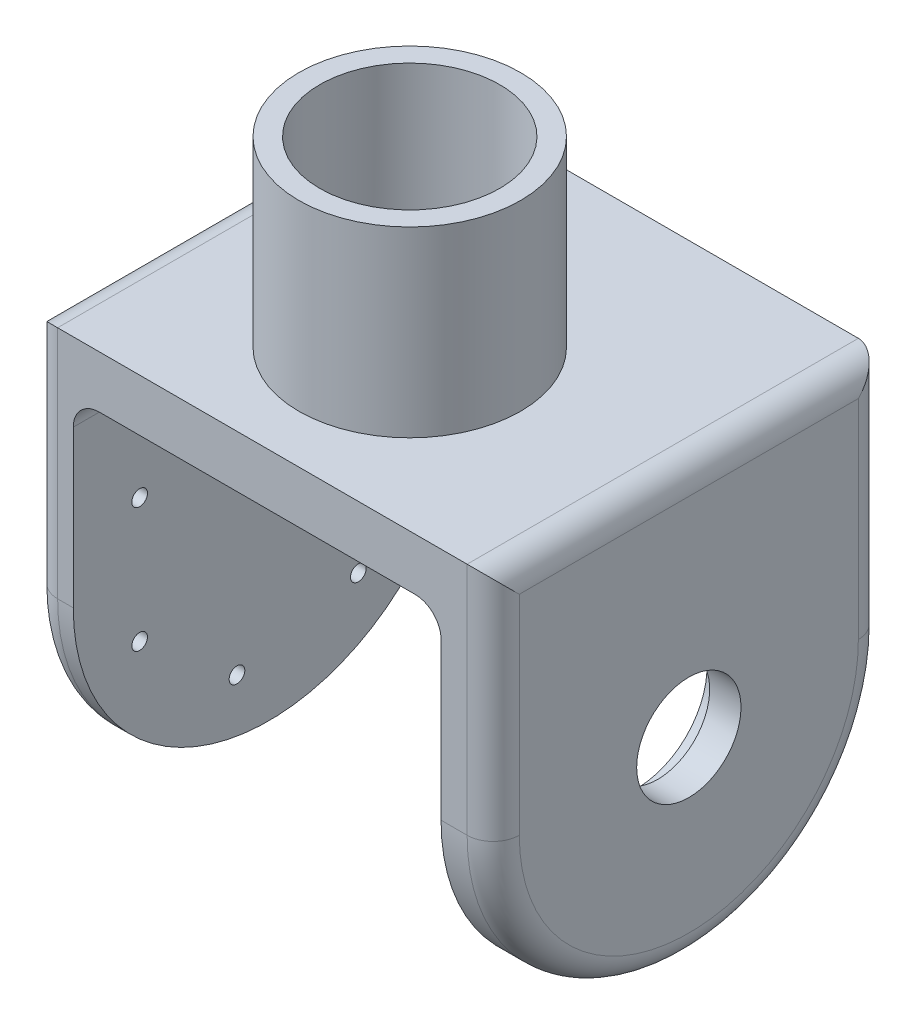
ISO-10303-21;
HEADER;
FILE_DESCRIPTION(('STEP AP214'),'2;1');
FILE_NAME('part.step','',(''),(''),'','','');
FILE_SCHEMA(('AUTOMOTIVE_DESIGN { 1 0 10303 214 1 1 1 1 }'));
ENDSEC;
DATA;
#1=APPLICATION_CONTEXT('core data for automotive mechanical design processes');
#2=APPLICATION_PROTOCOL_DEFINITION('international standard','automotive_design',2000,#1);
#3=PRODUCT_CONTEXT('',#1,'mechanical');
#4=PRODUCT('Part','Part','',(#3));
#5=PRODUCT_RELATED_PRODUCT_CATEGORY('part','',(#4));
#6=PRODUCT_DEFINITION_FORMATION('','',#4);
#7=PRODUCT_DEFINITION_CONTEXT('part definition',#1,'design');
#8=PRODUCT_DEFINITION('design','',#6,#7);
#9=PRODUCT_DEFINITION_SHAPE('','',#8);
#10=(LENGTH_UNIT() NAMED_UNIT(*) SI_UNIT(.MILLI.,.METRE.));
#11=(NAMED_UNIT(*) PLANE_ANGLE_UNIT() SI_UNIT($,.RADIAN.));
#12=(NAMED_UNIT(*) SI_UNIT($,.STERADIAN.) SOLID_ANGLE_UNIT());
#13=UNCERTAINTY_MEASURE_WITH_UNIT(LENGTH_MEASURE(1.E-05),#10,'distance_accuracy_value','');
#14=(GEOMETRIC_REPRESENTATION_CONTEXT(3) GLOBAL_UNCERTAINTY_ASSIGNED_CONTEXT((#13)) GLOBAL_UNIT_ASSIGNED_CONTEXT((#10,
#11,#12)) REPRESENTATION_CONTEXT('',''));
#15=CARTESIAN_POINT('',(0.,0.,0.));
#16=DIRECTION('',(0.,0.,1.));
#17=DIRECTION('',(1.,0.,0.));
#18=AXIS2_PLACEMENT_3D('',#15,#16,#17);
#19=CARTESIAN_POINT('',(8.,45.,37.5));
#20=DIRECTION('',(0.,-1.,0.));
#21=DIRECTION('',(0.,0.,-1.));
#22=AXIS2_PLACEMENT_3D('',#19,#20,#21);
#23=PLANE('',#22);
#24=CARTESIAN_POINT('',(42.,45.,7.));
#25=DIRECTION('',(0.,-1.,0.));
#26=DIRECTION('',(0.,0.,-1.));
#27=AXIS2_PLACEMENT_3D('',#24,#25,#26);
#28=CIRCLE('',#27,21.25);
#29=CARTESIAN_POINT('',(42.,45.,-14.25));
#30=VERTEX_POINT('',#29);
#31=EDGE_CURVE('E88',#30,#30,#28,.F.);
#32=ORIENTED_EDGE('',*,*,#31,.F.);
#33=EDGE_LOOP('',(#32));
#34=FACE_BOUND('',#33,.T.);
#35=CARTESIAN_POINT('',(42.,45.,7.));
#36=DIRECTION('',(0.,-1.,0.));
#37=DIRECTION('',(0.,0.,-1.));
#38=AXIS2_PLACEMENT_3D('',#35,#36,#37);
#39=CIRCLE('',#38,17.25);
#40=CARTESIAN_POINT('',(42.,45.,-10.25));
#41=VERTEX_POINT('',#40);
#42=EDGE_CURVE('E79',#41,#41,#39,.F.);
#43=ORIENTED_EDGE('',*,*,#42,.T.);
#44=EDGE_LOOP('',(#43));
#45=FACE_BOUND('',#44,.T.);
#46=ADVANCED_FACE('F75',(#34,#45),#23,.T.);
#47=CARTESIAN_POINT('',(42.,80.,7.));
#48=DIRECTION('',(0.,1.,0.));
#49=DIRECTION('',(0.,0.,1.));
#50=AXIS2_PLACEMENT_3D('',#47,#48,#49);
#51=PLANE('',#50);
#52=CARTESIAN_POINT('',(42.,80.,7.));
#53=DIRECTION('',(0.,1.,0.));
#54=DIRECTION('',(0.,0.,1.));
#55=AXIS2_PLACEMENT_3D('',#52,#53,#54);
#56=CIRCLE('',#55,17.25);
#57=CARTESIAN_POINT('',(42.,80.,24.25));
#58=VERTEX_POINT('',#57);
#59=EDGE_CURVE('E83',#58,#58,#56,.T.);
#60=ORIENTED_EDGE('',*,*,#59,.F.);
#61=EDGE_LOOP('',(#60));
#62=FACE_BOUND('',#61,.T.);
#63=CARTESIAN_POINT('',(42.,80.,7.));
#64=DIRECTION('',(0.,1.,0.));
#65=DIRECTION('',(0.,0.,1.));
#66=AXIS2_PLACEMENT_3D('',#63,#64,#65);
#67=CIRCLE('',#66,21.25);
#68=CARTESIAN_POINT('',(42.,80.,28.25));
#69=VERTEX_POINT('',#68);
#70=EDGE_CURVE('E12',#69,#69,#67,.T.);
#71=ORIENTED_EDGE('',*,*,#70,.T.);
#72=EDGE_LOOP('',(#71));
#73=FACE_BOUND('',#72,.T.);
#74=ADVANCED_FACE('F103',(#62,#73),#51,.T.);
#75=CARTESIAN_POINT('',(42.,-37.502,7.));
#76=DIRECTION('',(0.,1.,0.));
#77=DIRECTION('',(0.,0.,1.));
#78=AXIS2_PLACEMENT_3D('',#75,#76,#77);
#79=CYLINDRICAL_SURFACE('',#78,21.25);
#80=ORIENTED_EDGE('',*,*,#70,.F.);
#81=EDGE_LOOP('',(#80));
#82=FACE_BOUND('',#81,.T.);
#83=ORIENTED_EDGE('',*,*,#31,.T.);
#84=EDGE_LOOP('',(#83));
#85=FACE_BOUND('',#84,.T.);
#86=ADVANCED_FACE('F98',(#82,#85),#79,.T.);
#87=CARTESIAN_POINT('',(42.,-37.502,7.));
#88=DIRECTION('',(0.,1.,0.));
#89=DIRECTION('',(0.,0.,1.));
#90=AXIS2_PLACEMENT_3D('',#87,#88,#89);
#91=CYLINDRICAL_SURFACE('',#90,17.25);
#92=ORIENTED_EDGE('',*,*,#59,.T.);
#93=EDGE_LOOP('',(#92));
#94=FACE_BOUND('',#93,.T.);
#95=ORIENTED_EDGE('',*,*,#42,.F.);
#96=EDGE_LOOP('',(#95));
#97=FACE_BOUND('',#96,.T.);
#98=ADVANCED_FACE('F77',(#94,#97),#91,.F.);
#99=CLOSED_SHELL('',(#46,#74,#86,#98));
#100=MANIFOLD_SOLID_BREP('B2_NOT_SHOWN',#99);
#101=CARTESIAN_POINT('',(88.5,0.,0.));
#102=DIRECTION('',(-1.,0.,0.));
#103=DIRECTION('',(0.,0.,1.));
#104=AXIS2_PLACEMENT_3D('',#101,#102,#103);
#105=CYLINDRICAL_SURFACE('',#104,10.);
#106=CARTESIAN_POINT('',(88.5,0.,0.));
#107=DIRECTION('',(1.,0.,0.));
#108=DIRECTION('',(0.,0.,-1.));
#109=AXIS2_PLACEMENT_3D('',#106,#107,#108);
#110=CIRCLE('',#109,10.);
#111=CARTESIAN_POINT('',(88.5,0.,-10.));
#112=VERTEX_POINT('',#111);
#113=EDGE_CURVE('E265',#112,#112,#110,.T.);
#114=ORIENTED_EDGE('',*,*,#113,.T.);
#115=EDGE_LOOP('',(#114));
#116=FACE_BOUND('',#115,.T.);
#117=CARTESIAN_POINT('',(82.5,0.,0.));
#118=DIRECTION('',(-1.,0.,0.));
#119=DIRECTION('',(0.,0.,1.));
#120=AXIS2_PLACEMENT_3D('',#117,#118,#119);
#121=CIRCLE('',#120,10.);
#122=CARTESIAN_POINT('',(82.5,0.,10.));
#123=VERTEX_POINT('',#122);
#124=EDGE_CURVE('E342',#123,#123,#121,.T.);
#125=ORIENTED_EDGE('',*,*,#124,.T.);
#126=EDGE_LOOP('',(#125));
#127=FACE_BOUND('',#126,.T.);
#128=ADVANCED_FACE('F137',(#116,#127),#105,.F.);
#129=CARTESIAN_POINT('',(78.5,0.,0.));
#130=DIRECTION('',(1.,0.,0.));
#131=DIRECTION('',(0.,0.,-1.));
#132=AXIS2_PLACEMENT_3D('',#129,#130,#131);
#133=PLANE('',#132);
#134=CARTESIAN_POINT('',(78.5,0.,0.));
#135=DIRECTION('',(-1.,0.,0.));
#136=DIRECTION('',(0.,0.,1.));
#137=AXIS2_PLACEMENT_3D('',#134,#135,#136);
#138=CIRCLE('',#137,13.5);
#139=CARTESIAN_POINT('',(78.5,0.,13.5));
#140=VERTEX_POINT('',#139);
#141=EDGE_CURVE('E401',#140,#140,#138,.T.);
#142=ORIENTED_EDGE('',*,*,#141,.F.);
#143=EDGE_LOOP('',(#142));
#144=FACE_BOUND('',#143,.T.);
#145=CARTESIAN_POINT('',(78.5,0.,0.));
#146=DIRECTION('',(-1.,0.,0.));
#147=DIRECTION('',(0.,0.,1.));
#148=AXIS2_PLACEMENT_3D('',#145,#146,#147);
#149=CIRCLE('',#148,15.);
#150=CARTESIAN_POINT('',(78.5,0.,15.));
#151=VERTEX_POINT('',#150);
#152=EDGE_CURVE('E345',#151,#151,#149,.T.);
#153=ORIENTED_EDGE('',*,*,#152,.T.);
#154=EDGE_LOOP('',(#153));
#155=FACE_BOUND('',#154,.T.);
#156=ADVANCED_FACE('F462',(#144,#155),#133,.F.);
#157=CARTESIAN_POINT('',(8.,0.,0.));
#158=DIRECTION('',(1.,0.,0.));
#159=DIRECTION('',(0.,0.,-1.));
#160=AXIS2_PLACEMENT_3D('',#157,#158,#159);
#161=PLANE('',#160);
#162=CARTESIAN_POINT('',(8.,26.8105175850002,6.11932568379838));
#163=DIRECTION('',(1.,0.,0.));
#164=DIRECTION('',(0.,0.,-1.));
#165=AXIS2_PLACEMENT_3D('',#162,#163,#164);
#166=CIRCLE('',#165,1.5);
#167=CARTESIAN_POINT('',(8.,26.8105175850002,4.61932568379838));
#168=VERTEX_POINT('',#167);
#169=EDGE_CURVE('E286',#168,#168,#166,.T.);
#170=ORIENTED_EDGE('',*,*,#169,.F.);
#171=EDGE_LOOP('',(#170));
#172=FACE_BOUND('',#171,.T.);
#173=CARTESIAN_POINT('',(8.,-11.9318028257327,24.7766438673166));
#174=DIRECTION('',(1.,0.,0.));
#175=DIRECTION('',(0.,0.,-1.));
#176=AXIS2_PLACEMENT_3D('',#173,#174,#175);
#177=CIRCLE('',#176,1.5);
#178=CARTESIAN_POINT('',(8.,-11.9318028257327,23.2766438673166));
#179=VERTEX_POINT('',#178);
#180=EDGE_CURVE('E298',#179,#179,#177,.T.);
#181=ORIENTED_EDGE('',*,*,#180,.F.);
#182=EDGE_LOOP('',(#181));
#183=FACE_BOUND('',#182,.T.);
#184=CARTESIAN_POINT('',(8.,-21.5003657678709,-17.1459695511151));
#185=DIRECTION('',(1.,0.,0.));
#186=DIRECTION('',(0.,0.,-1.));
#187=AXIS2_PLACEMENT_3D('',#184,#185,#186);
#188=CIRCLE('',#187,1.5);
#189=CARTESIAN_POINT('',(8.,-21.5003657678709,-18.6459695511151));
#190=VERTEX_POINT('',#189);
#191=EDGE_CURVE('E310',#190,#190,#188,.T.);
#192=ORIENTED_EDGE('',*,*,#191,.F.);
#193=EDGE_LOOP('',(#192));
#194=FACE_BOUND('',#193,.T.);
#195=CARTESIAN_POINT('',(8.,0.,-27.5));
#196=DIRECTION('',(1.,0.,0.));
#197=DIRECTION('',(0.,0.,-1.));
#198=AXIS2_PLACEMENT_3D('',#195,#196,#197);
#199=CIRCLE('',#198,1.5);
#200=CARTESIAN_POINT('',(8.,0.,-29.));
#201=VERTEX_POINT('',#200);
#202=EDGE_CURVE('E316',#201,#201,#199,.T.);
#203=ORIENTED_EDGE('',*,*,#202,.F.);
#204=EDGE_LOOP('',(#203));
#205=FACE_BOUND('',#204,.T.);
#206=CARTESIAN_POINT('',(8.,-26.8105175850001,6.11932568379875));
#207=DIRECTION('',(1.,0.,0.));
#208=DIRECTION('',(0.,0.,-1.));
#209=AXIS2_PLACEMENT_3D('',#206,#207,#208);
#210=CIRCLE('',#209,1.5);
#211=CARTESIAN_POINT('',(8.,-26.8105175850001,4.61932568379875));
#212=VERTEX_POINT('',#211);
#213=EDGE_CURVE('E304',#212,#212,#210,.T.);
#214=ORIENTED_EDGE('',*,*,#213,.F.);
#215=EDGE_LOOP('',(#214));
#216=FACE_BOUND('',#215,.T.);
#217=CARTESIAN_POINT('',(8.,11.931802825733,24.7766438673164));
#218=DIRECTION('',(1.,0.,0.));
#219=DIRECTION('',(0.,0.,-1.));
#220=AXIS2_PLACEMENT_3D('',#217,#218,#219);
#221=CIRCLE('',#220,1.5);
#222=CARTESIAN_POINT('',(8.,11.931802825733,23.2766438673164));
#223=VERTEX_POINT('',#222);
#224=EDGE_CURVE('E292',#223,#223,#221,.T.);
#225=ORIENTED_EDGE('',*,*,#224,.F.);
#226=EDGE_LOOP('',(#225));
#227=FACE_BOUND('',#226,.T.);
#228=CARTESIAN_POINT('',(8.,21.5003657678706,-17.1459695511154));
#229=DIRECTION('',(1.,0.,0.));
#230=DIRECTION('',(0.,0.,-1.));
#231=AXIS2_PLACEMENT_3D('',#228,#229,#230);
#232=CIRCLE('',#231,1.5);
#233=CARTESIAN_POINT('',(8.,21.5003657678706,-18.6459695511154));
#234=VERTEX_POINT('',#233);
#235=EDGE_CURVE('E280',#234,#234,#232,.T.);
#236=ORIENTED_EDGE('',*,*,#235,.F.);
#237=EDGE_LOOP('',(#236));
#238=FACE_BOUND('',#237,.T.);
#239=DIRECTION('',(0.,1.,0.));
#240=VECTOR('',#239,1.);
#241=CARTESIAN_POINT('',(8.,45.,-37.5));
#242=LINE('',#241,#240);
#243=CARTESIAN_POINT('',(8.,0.,-37.5));
#244=VERTEX_POINT('',#243);
#245=CARTESIAN_POINT('',(8.,30.,-37.5));
#246=VERTEX_POINT('',#245);
#247=EDGE_CURVE('E324',#244,#246,#242,.T.);
#248=ORIENTED_EDGE('',*,*,#247,.T.);
#249=DIRECTION('',(0.,0.,1.));
#250=VECTOR('',#249,1.);
#251=CARTESIAN_POINT('',(8.,30.,0.));
#252=LINE('',#251,#250);
#253=CARTESIAN_POINT('',(8.,30.,37.5));
#254=VERTEX_POINT('',#253);
#255=EDGE_CURVE('E383',#246,#254,#252,.T.);
#256=ORIENTED_EDGE('',*,*,#255,.T.);
#257=DIRECTION('',(0.,-1.,0.));
#258=VECTOR('',#257,1.);
#259=CARTESIAN_POINT('',(8.,0.,37.5));
#260=LINE('',#259,#258);
#261=CARTESIAN_POINT('',(8.,0.,37.5));
#262=VERTEX_POINT('',#261);
#263=EDGE_CURVE('E327',#254,#262,#260,.T.);
#264=ORIENTED_EDGE('',*,*,#263,.T.);
#265=CARTESIAN_POINT('',(8.,0.,0.));
#266=DIRECTION('',(1.,0.,0.));
#267=DIRECTION('',(0.,0.,-1.));
#268=AXIS2_PLACEMENT_3D('',#265,#266,#267);
#269=CIRCLE('',#268,37.5);
#270=EDGE_CURVE('E319',#262,#244,#269,.T.);
#271=ORIENTED_EDGE('',*,*,#270,.T.);
#272=EDGE_LOOP('',(#248,#256,#264,#271));
#273=FACE_BOUND('',#272,.T.);
#274=ADVANCED_FACE('F428',(#172,#183,#194,#205,#216,#227,#238,#273),#161,.T.);
#275=CARTESIAN_POINT('',(0.,0.,0.));
#276=DIRECTION('',(1.,0.,0.));
#277=DIRECTION('',(0.,0.,-1.));
#278=AXIS2_PLACEMENT_3D('',#275,#276,#277);
#279=PLANE('',#278);
#280=DIRECTION('',(0.,1.,0.));
#281=VECTOR('',#280,1.);
#282=CARTESIAN_POINT('',(0.,0.,-32.5));
#283=LINE('',#282,#281);
#284=CARTESIAN_POINT('',(0.,40.,-32.5));
#285=VERTEX_POINT('',#284);
#286=CARTESIAN_POINT('',(0.,0.,-32.5));
#287=VERTEX_POINT('',#286);
#288=EDGE_CURVE('E159',#285,#287,#283,.F.);
#289=ORIENTED_EDGE('',*,*,#288,.T.);
#290=CARTESIAN_POINT('',(0.,0.,0.));
#291=DIRECTION('',(1.,0.,0.));
#292=DIRECTION('',(0.,0.,-1.));
#293=AXIS2_PLACEMENT_3D('',#290,#291,#292);
#294=CIRCLE('',#293,32.5);
#295=CARTESIAN_POINT('',(0.,0.,32.5));
#296=VERTEX_POINT('',#295);
#297=EDGE_CURVE('E154',#287,#296,#294,.F.);
#298=ORIENTED_EDGE('',*,*,#297,.T.);
#299=DIRECTION('',(0.,-1.,0.));
#300=VECTOR('',#299,1.);
#301=CARTESIAN_POINT('',(0.,0.,32.5));
#302=LINE('',#301,#300);
#303=CARTESIAN_POINT('',(0.,40.,32.5));
#304=VERTEX_POINT('',#303);
#305=EDGE_CURVE('E367',#296,#304,#302,.F.);
#306=ORIENTED_EDGE('',*,*,#305,.T.);
#307=DIRECTION('',(0.,0.,1.));
#308=VECTOR('',#307,1.);
#309=CARTESIAN_POINT('',(0.,40.,0.));
#310=LINE('',#309,#308);
#311=EDGE_CURVE('E364',#304,#285,#310,.F.);
#312=ORIENTED_EDGE('',*,*,#311,.T.);
#313=EDGE_LOOP('',(#289,#298,#306,#312));
#314=FACE_BOUND('',#313,.T.);
#315=CARTESIAN_POINT('',(0.,21.5003657678706,-17.1459695511154));
#316=DIRECTION('',(1.,0.,0.));
#317=DIRECTION('',(0.,0.,-1.));
#318=AXIS2_PLACEMENT_3D('',#315,#316,#317);
#319=CIRCLE('',#318,1.5);
#320=CARTESIAN_POINT('',(0.,21.5003657678706,-18.6459695511154));
#321=VERTEX_POINT('',#320);
#322=EDGE_CURVE('E279',#321,#321,#319,.T.);
#323=ORIENTED_EDGE('',*,*,#322,.T.);
#324=EDGE_LOOP('',(#323));
#325=FACE_BOUND('',#324,.T.);
#326=CARTESIAN_POINT('',(0.,26.8105175850002,6.11932568379838));
#327=DIRECTION('',(1.,0.,0.));
#328=DIRECTION('',(0.,0.,-1.));
#329=AXIS2_PLACEMENT_3D('',#326,#327,#328);
#330=CIRCLE('',#329,1.5);
#331=CARTESIAN_POINT('',(0.,26.8105175850002,4.61932568379838));
#332=VERTEX_POINT('',#331);
#333=EDGE_CURVE('E283',#332,#332,#330,.T.);
#334=ORIENTED_EDGE('',*,*,#333,.T.);
#335=EDGE_LOOP('',(#334));
#336=FACE_BOUND('',#335,.T.);
#337=CARTESIAN_POINT('',(0.,11.931802825733,24.7766438673164));
#338=DIRECTION('',(1.,0.,0.));
#339=DIRECTION('',(0.,0.,-1.));
#340=AXIS2_PLACEMENT_3D('',#337,#338,#339);
#341=CIRCLE('',#340,1.5);
#342=CARTESIAN_POINT('',(0.,11.931802825733,23.2766438673164));
#343=VERTEX_POINT('',#342);
#344=EDGE_CURVE('E289',#343,#343,#341,.T.);
#345=ORIENTED_EDGE('',*,*,#344,.T.);
#346=EDGE_LOOP('',(#345));
#347=FACE_BOUND('',#346,.T.);
#348=CARTESIAN_POINT('',(0.,-11.9318028257327,24.7766438673166));
#349=DIRECTION('',(1.,0.,0.));
#350=DIRECTION('',(0.,0.,-1.));
#351=AXIS2_PLACEMENT_3D('',#348,#349,#350);
#352=CIRCLE('',#351,1.5);
#353=CARTESIAN_POINT('',(0.,-11.9318028257327,23.2766438673166));
#354=VERTEX_POINT('',#353);
#355=EDGE_CURVE('E295',#354,#354,#352,.T.);
#356=ORIENTED_EDGE('',*,*,#355,.T.);
#357=EDGE_LOOP('',(#356));
#358=FACE_BOUND('',#357,.T.);
#359=CARTESIAN_POINT('',(0.,-26.8105175850001,6.11932568379875));
#360=DIRECTION('',(1.,0.,0.));
#361=DIRECTION('',(0.,0.,-1.));
#362=AXIS2_PLACEMENT_3D('',#359,#360,#361);
#363=CIRCLE('',#362,1.5);
#364=CARTESIAN_POINT('',(0.,-26.8105175850001,4.61932568379875));
#365=VERTEX_POINT('',#364);
#366=EDGE_CURVE('E301',#365,#365,#363,.T.);
#367=ORIENTED_EDGE('',*,*,#366,.T.);
#368=EDGE_LOOP('',(#367));
#369=FACE_BOUND('',#368,.T.);
#370=CARTESIAN_POINT('',(0.,-21.5003657678709,-17.1459695511151));
#371=DIRECTION('',(1.,0.,0.));
#372=DIRECTION('',(0.,0.,-1.));
#373=AXIS2_PLACEMENT_3D('',#370,#371,#372);
#374=CIRCLE('',#373,1.5);
#375=CARTESIAN_POINT('',(0.,-21.5003657678709,-18.6459695511151));
#376=VERTEX_POINT('',#375);
#377=EDGE_CURVE('E307',#376,#376,#374,.T.);
#378=ORIENTED_EDGE('',*,*,#377,.T.);
#379=EDGE_LOOP('',(#378));
#380=FACE_BOUND('',#379,.T.);
#381=CARTESIAN_POINT('',(0.,0.,-27.5));
#382=DIRECTION('',(1.,0.,0.));
#383=DIRECTION('',(0.,0.,-1.));
#384=AXIS2_PLACEMENT_3D('',#381,#382,#383);
#385=CIRCLE('',#384,1.5);
#386=CARTESIAN_POINT('',(0.,0.,-29.));
#387=VERTEX_POINT('',#386);
#388=EDGE_CURVE('E313',#387,#387,#385,.T.);
#389=ORIENTED_EDGE('',*,*,#388,.T.);
#390=EDGE_LOOP('',(#389));
#391=FACE_BOUND('',#390,.T.);
#392=ADVANCED_FACE('F424',(#314,#325,#336,#347,#358,#369,#380,#391),#279,.F.);
#393=CARTESIAN_POINT('',(8.,0.,0.));
#394=DIRECTION('',(-1.,0.,0.));
#395=DIRECTION('',(0.,0.,1.));
#396=AXIS2_PLACEMENT_3D('',#393,#394,#395);
#397=CYLINDRICAL_SURFACE('',#396,37.5);
#398=DIRECTION('',(-1.,0.,0.));
#399=VECTOR('',#398,1.);
#400=CARTESIAN_POINT('',(8.,0.,37.5));
#401=LINE('',#400,#399);
#402=CARTESIAN_POINT('',(5.,0.,37.5));
#403=VERTEX_POINT('',#402);
#404=EDGE_CURVE('E329',#262,#403,#401,.T.);
#405=ORIENTED_EDGE('',*,*,#404,.T.);
#406=CARTESIAN_POINT('',(5.,0.,0.));
#407=DIRECTION('',(1.,0.,0.));
#408=DIRECTION('',(0.,0.,-1.));
#409=AXIS2_PLACEMENT_3D('',#406,#407,#408);
#410=CIRCLE('',#409,37.5);
#411=CARTESIAN_POINT('',(5.,0.,-37.5));
#412=VERTEX_POINT('',#411);
#413=EDGE_CURVE('E372',#403,#412,#410,.T.);
#414=ORIENTED_EDGE('',*,*,#413,.T.);
#415=DIRECTION('',(-1.,0.,0.));
#416=VECTOR('',#415,1.);
#417=CARTESIAN_POINT('',(8.,0.,-37.5));
#418=LINE('',#417,#416);
#419=EDGE_CURVE('E338',#244,#412,#418,.T.);
#420=ORIENTED_EDGE('',*,*,#419,.F.);
#421=ORIENTED_EDGE('',*,*,#270,.F.);
#422=EDGE_LOOP('',(#405,#414,#420,#421));
#423=FACE_BOUND('',#422,.T.);
#424=ADVANCED_FACE('F427',(#423),#397,.T.);
#425=CARTESIAN_POINT('',(8.,45.,-37.5));
#426=DIRECTION('',(0.,0.,1.));
#427=DIRECTION('',(1.,0.,0.));
#428=AXIS2_PLACEMENT_3D('',#425,#426,#427);
#429=PLANE('',#428);
#430=DIRECTION('',(-1.,0.,0.));
#431=VECTOR('',#430,1.);
#432=CARTESIAN_POINT('',(8.,45.,-37.5));
#433=LINE('',#432,#431);
#434=CARTESIAN_POINT('',(83.5,45.,-37.5));
#435=VERTEX_POINT('',#434);
#436=CARTESIAN_POINT('',(5.,45.,-37.5));
#437=VERTEX_POINT('',#436);
#438=EDGE_CURVE('E335',#435,#437,#433,.T.);
#439=ORIENTED_EDGE('',*,*,#438,.F.);
#440=DIRECTION('',(0.,1.,0.));
#441=VECTOR('',#440,1.);
#442=CARTESIAN_POINT('',(83.5,0.,-37.5));
#443=LINE('',#442,#441);
#444=CARTESIAN_POINT('',(83.5,0.,-37.5));
#445=VERTEX_POINT('',#444);
#446=EDGE_CURVE('E245',#435,#445,#443,.F.);
#447=ORIENTED_EDGE('',*,*,#446,.T.);
#448=DIRECTION('',(-1.,0.,0.));
#449=VECTOR('',#448,1.);
#450=CARTESIAN_POINT('',(88.5,0.,-37.5));
#451=LINE('',#450,#449);
#452=CARTESIAN_POINT('',(78.5,0.,-37.5));
#453=VERTEX_POINT('',#452);
#454=EDGE_CURVE('E239',#445,#453,#451,.T.);
#455=ORIENTED_EDGE('',*,*,#454,.T.);
#456=DIRECTION('',(0.,1.,0.));
#457=VECTOR('',#456,1.);
#458=CARTESIAN_POINT('',(78.5,45.,-37.5));
#459=LINE('',#458,#457);
#460=CARTESIAN_POINT('',(78.5,30.,-37.5));
#461=VERTEX_POINT('',#460);
#462=EDGE_CURVE('E243',#453,#461,#459,.T.);
#463=ORIENTED_EDGE('',*,*,#462,.T.);
#464=CARTESIAN_POINT('',(73.5,30.,-37.5));
#465=DIRECTION('',(0.,0.,1.));
#466=DIRECTION('',(1.,0.,0.));
#467=AXIS2_PLACEMENT_3D('',#464,#465,#466);
#468=CIRCLE('',#467,5.);
#469=CARTESIAN_POINT('',(73.5,35.,-37.5));
#470=VERTEX_POINT('',#469);
#471=EDGE_CURVE('E386',#461,#470,#468,.T.);
#472=ORIENTED_EDGE('',*,*,#471,.T.);
#473=DIRECTION('',(-1.,0.,0.));
#474=VECTOR('',#473,1.);
#475=CARTESIAN_POINT('',(78.5,35.,-37.5));
#476=LINE('',#475,#474);
#477=CARTESIAN_POINT('',(13.,35.,-37.5));
#478=VERTEX_POINT('',#477);
#479=EDGE_CURVE('E249',#470,#478,#476,.T.);
#480=ORIENTED_EDGE('',*,*,#479,.T.);
#481=CARTESIAN_POINT('',(13.,30.,-37.5));
#482=DIRECTION('',(0.,0.,1.));
#483=DIRECTION('',(1.,0.,0.));
#484=AXIS2_PLACEMENT_3D('',#481,#482,#483);
#485=CIRCLE('',#484,5.);
#486=EDGE_CURVE('E73',#478,#246,#485,.T.);
#487=ORIENTED_EDGE('',*,*,#486,.T.);
#488=ORIENTED_EDGE('',*,*,#247,.F.);
#489=ORIENTED_EDGE('',*,*,#419,.T.);
#490=DIRECTION('',(0.,1.,0.));
#491=VECTOR('',#490,1.);
#492=CARTESIAN_POINT('',(5.,45.,-37.5));
#493=LINE('',#492,#491);
#494=EDGE_CURVE('E361',#412,#437,#493,.T.);
#495=ORIENTED_EDGE('',*,*,#494,.T.);
#496=EDGE_LOOP('',(#439,#447,#455,#463,#472,#480,#487,#488,#489,#495));
#497=FACE_BOUND('',#496,.T.);
#498=ADVANCED_FACE('F242',(#497),#429,.F.);
#499=CARTESIAN_POINT('',(8.,45.,37.5));
#500=DIRECTION('',(0.,-1.,0.));
#501=DIRECTION('',(0.,0.,-1.));
#502=AXIS2_PLACEMENT_3D('',#499,#500,#501);
#503=PLANE('',#502);
#504=ORIENTED_EDGE('',*,*,#438,.T.);
#505=DIRECTION('',(0.,0.,1.));
#506=VECTOR('',#505,1.);
#507=CARTESIAN_POINT('',(5.,45.,37.5));
#508=LINE('',#507,#506);
#509=CARTESIAN_POINT('',(5.,45.,37.5));
#510=VERTEX_POINT('',#509);
#511=EDGE_CURVE('E376',#437,#510,#508,.T.);
#512=ORIENTED_EDGE('',*,*,#511,.T.);
#513=DIRECTION('',(-1.,0.,0.));
#514=VECTOR('',#513,1.);
#515=CARTESIAN_POINT('',(8.,45.,37.5));
#516=LINE('',#515,#514);
#517=CARTESIAN_POINT('',(83.5,45.,37.5));
#518=VERTEX_POINT('',#517);
#519=EDGE_CURVE('E332',#518,#510,#516,.T.);
#520=ORIENTED_EDGE('',*,*,#519,.F.);
#521=DIRECTION('',(0.,0.,1.));
#522=VECTOR('',#521,1.);
#523=CARTESIAN_POINT('',(83.5,45.,-37.5));
#524=LINE('',#523,#522);
#525=EDGE_CURVE('E374',#518,#435,#524,.F.);
#526=ORIENTED_EDGE('',*,*,#525,.T.);
#527=EDGE_LOOP('',(#504,#512,#520,#526));
#528=FACE_BOUND('',#527,.T.);
#529=ADVANCED_FACE('F457',(#528),#503,.F.);
#530=CARTESIAN_POINT('',(8.,0.,37.5));
#531=DIRECTION('',(0.,0.,-1.));
#532=DIRECTION('',(-1.,0.,0.));
#533=AXIS2_PLACEMENT_3D('',#530,#531,#532);
#534=PLANE('',#533);
#535=DIRECTION('',(-1.,0.,0.));
#536=VECTOR('',#535,1.);
#537=CARTESIAN_POINT('',(88.5,0.,37.5));
#538=LINE('',#537,#536);
#539=CARTESIAN_POINT('',(83.5,0.,37.5));
#540=VERTEX_POINT('',#539);
#541=CARTESIAN_POINT('',(78.5,0.,37.5));
#542=VERTEX_POINT('',#541);
#543=EDGE_CURVE('E250',#540,#542,#538,.T.);
#544=ORIENTED_EDGE('',*,*,#543,.F.);
#545=DIRECTION('',(0.,-1.,0.));
#546=VECTOR('',#545,1.);
#547=CARTESIAN_POINT('',(83.5,45.,37.5));
#548=LINE('',#547,#546);
#549=EDGE_CURVE('E358',#540,#518,#548,.F.);
#550=ORIENTED_EDGE('',*,*,#549,.T.);
#551=ORIENTED_EDGE('',*,*,#519,.T.);
#552=DIRECTION('',(0.,-1.,0.));
#553=VECTOR('',#552,1.);
#554=CARTESIAN_POINT('',(5.,0.,37.5));
#555=LINE('',#554,#553);
#556=EDGE_CURVE('E355',#510,#403,#555,.T.);
#557=ORIENTED_EDGE('',*,*,#556,.T.);
#558=ORIENTED_EDGE('',*,*,#404,.F.);
#559=ORIENTED_EDGE('',*,*,#263,.F.);
#560=CARTESIAN_POINT('',(13.,30.,37.5));
#561=DIRECTION('',(0.,0.,-1.));
#562=DIRECTION('',(-1.,0.,0.));
#563=AXIS2_PLACEMENT_3D('',#560,#561,#562);
#564=CIRCLE('',#563,5.);
#565=CARTESIAN_POINT('',(13.,35.,37.5));
#566=VERTEX_POINT('',#565);
#567=EDGE_CURVE('E146',#254,#566,#564,.T.);
#568=ORIENTED_EDGE('',*,*,#567,.T.);
#569=DIRECTION('',(-1.,0.,0.));
#570=VECTOR('',#569,1.);
#571=CARTESIAN_POINT('',(78.5,35.,37.5));
#572=LINE('',#571,#570);
#573=CARTESIAN_POINT('',(73.5,35.,37.5));
#574=VERTEX_POINT('',#573);
#575=EDGE_CURVE('E276',#574,#566,#572,.T.);
#576=ORIENTED_EDGE('',*,*,#575,.F.);
#577=CARTESIAN_POINT('',(73.5,30.,37.5));
#578=DIRECTION('',(0.,0.,-1.));
#579=DIRECTION('',(-1.,0.,0.));
#580=AXIS2_PLACEMENT_3D('',#577,#578,#579);
#581=CIRCLE('',#580,5.);
#582=CARTESIAN_POINT('',(78.5,30.,37.5));
#583=VERTEX_POINT('',#582);
#584=EDGE_CURVE('E388',#574,#583,#581,.T.);
#585=ORIENTED_EDGE('',*,*,#584,.T.);
#586=DIRECTION('',(0.,-1.,0.));
#587=VECTOR('',#586,1.);
#588=CARTESIAN_POINT('',(78.5,0.,37.5));
#589=LINE('',#588,#587);
#590=EDGE_CURVE('E260',#583,#542,#589,.T.);
#591=ORIENTED_EDGE('',*,*,#590,.T.);
#592=EDGE_LOOP('',(#544,#550,#551,#557,#558,#559,#568,#576,#585,#591));
#593=FACE_BOUND('',#592,.T.);
#594=ADVANCED_FACE('F447',(#593),#534,.F.);
#595=CARTESIAN_POINT('',(8.,0.,-27.5));
#596=DIRECTION('',(-1.,0.,0.));
#597=DIRECTION('',(0.,0.,1.));
#598=AXIS2_PLACEMENT_3D('',#595,#596,#597);
#599=CYLINDRICAL_SURFACE('',#598,1.5);
#600=ORIENTED_EDGE('',*,*,#202,.T.);
#601=EDGE_LOOP('',(#600));
#602=FACE_BOUND('',#601,.T.);
#603=ORIENTED_EDGE('',*,*,#388,.F.);
#604=EDGE_LOOP('',(#603));
#605=FACE_BOUND('',#604,.T.);
#606=ADVANCED_FACE('F444',(#602,#605),#599,.F.);
#607=CARTESIAN_POINT('',(8.,-21.5003657678709,-17.1459695511151));
#608=DIRECTION('',(-1.,0.,0.));
#609=DIRECTION('',(0.,0.,1.));
#610=AXIS2_PLACEMENT_3D('',#607,#608,#609);
#611=CYLINDRICAL_SURFACE('',#610,1.5);
#612=ORIENTED_EDGE('',*,*,#191,.T.);
#613=EDGE_LOOP('',(#612));
#614=FACE_BOUND('',#613,.T.);
#615=ORIENTED_EDGE('',*,*,#377,.F.);
#616=EDGE_LOOP('',(#615));
#617=FACE_BOUND('',#616,.T.);
#618=ADVANCED_FACE('F446',(#614,#617),#611,.F.);
#619=CARTESIAN_POINT('',(8.,-26.8105175850001,6.11932568379875));
#620=DIRECTION('',(-1.,0.,0.));
#621=DIRECTION('',(0.,0.,1.));
#622=AXIS2_PLACEMENT_3D('',#619,#620,#621);
#623=CYLINDRICAL_SURFACE('',#622,1.5);
#624=ORIENTED_EDGE('',*,*,#213,.T.);
#625=EDGE_LOOP('',(#624));
#626=FACE_BOUND('',#625,.T.);
#627=ORIENTED_EDGE('',*,*,#366,.F.);
#628=EDGE_LOOP('',(#627));
#629=FACE_BOUND('',#628,.T.);
#630=ADVANCED_FACE('F454',(#626,#629),#623,.F.);
#631=CARTESIAN_POINT('',(8.,-11.9318028257327,24.7766438673166));
#632=DIRECTION('',(-1.,0.,0.));
#633=DIRECTION('',(0.,0.,1.));
#634=AXIS2_PLACEMENT_3D('',#631,#632,#633);
#635=CYLINDRICAL_SURFACE('',#634,1.5);
#636=ORIENTED_EDGE('',*,*,#180,.T.);
#637=EDGE_LOOP('',(#636));
#638=FACE_BOUND('',#637,.T.);
#639=ORIENTED_EDGE('',*,*,#355,.F.);
#640=EDGE_LOOP('',(#639));
#641=FACE_BOUND('',#640,.T.);
#642=ADVANCED_FACE('F498',(#638,#641),#635,.F.);
#643=CARTESIAN_POINT('',(8.,11.931802825733,24.7766438673164));
#644=DIRECTION('',(-1.,0.,0.));
#645=DIRECTION('',(0.,0.,1.));
#646=AXIS2_PLACEMENT_3D('',#643,#644,#645);
#647=CYLINDRICAL_SURFACE('',#646,1.5);
#648=ORIENTED_EDGE('',*,*,#224,.T.);
#649=EDGE_LOOP('',(#648));
#650=FACE_BOUND('',#649,.T.);
#651=ORIENTED_EDGE('',*,*,#344,.F.);
#652=EDGE_LOOP('',(#651));
#653=FACE_BOUND('',#652,.T.);
#654=ADVANCED_FACE('F494',(#650,#653),#647,.F.);
#655=CARTESIAN_POINT('',(8.,26.8105175850002,6.11932568379838));
#656=DIRECTION('',(-1.,0.,0.));
#657=DIRECTION('',(0.,0.,1.));
#658=AXIS2_PLACEMENT_3D('',#655,#656,#657);
#659=CYLINDRICAL_SURFACE('',#658,1.5);
#660=ORIENTED_EDGE('',*,*,#169,.T.);
#661=EDGE_LOOP('',(#660));
#662=FACE_BOUND('',#661,.T.);
#663=ORIENTED_EDGE('',*,*,#333,.F.);
#664=EDGE_LOOP('',(#663));
#665=FACE_BOUND('',#664,.T.);
#666=ADVANCED_FACE('F490',(#662,#665),#659,.F.);
#667=CARTESIAN_POINT('',(8.,21.5003657678706,-17.1459695511154));
#668=DIRECTION('',(-1.,0.,0.));
#669=DIRECTION('',(0.,0.,1.));
#670=AXIS2_PLACEMENT_3D('',#667,#668,#669);
#671=CYLINDRICAL_SURFACE('',#670,1.5);
#672=ORIENTED_EDGE('',*,*,#235,.T.);
#673=EDGE_LOOP('',(#672));
#674=FACE_BOUND('',#673,.T.);
#675=ORIENTED_EDGE('',*,*,#322,.F.);
#676=EDGE_LOOP('',(#675));
#677=FACE_BOUND('',#676,.T.);
#678=ADVANCED_FACE('F486',(#674,#677),#671,.F.);
#679=CARTESIAN_POINT('',(78.5,35.,0.));
#680=DIRECTION('',(0.,1.,0.));
#681=DIRECTION('',(0.,0.,1.));
#682=AXIS2_PLACEMENT_3D('',#679,#680,#681);
#683=PLANE('',#682);
#684=ORIENTED_EDGE('',*,*,#479,.F.);
#685=DIRECTION('',(0.,0.,-1.));
#686=VECTOR('',#685,1.);
#687=CARTESIAN_POINT('',(73.5,35.,37.5));
#688=LINE('',#687,#686);
#689=EDGE_CURVE('E381',#470,#574,#688,.F.);
#690=ORIENTED_EDGE('',*,*,#689,.T.);
#691=ORIENTED_EDGE('',*,*,#575,.T.);
#692=DIRECTION('',(0.,0.,1.));
#693=VECTOR('',#692,1.);
#694=CARTESIAN_POINT('',(13.,35.,0.));
#695=LINE('',#694,#693);
#696=EDGE_CURVE('E379',#566,#478,#695,.F.);
#697=ORIENTED_EDGE('',*,*,#696,.T.);
#698=EDGE_LOOP('',(#684,#690,#691,#697));
#699=FACE_BOUND('',#698,.T.);
#700=ADVANCED_FACE('F480',(#699),#683,.F.);
#701=CARTESIAN_POINT('',(78.5,0.,0.));
#702=DIRECTION('',(-1.,0.,0.));
#703=DIRECTION('',(0.,0.,1.));
#704=AXIS2_PLACEMENT_3D('',#701,#702,#703);
#705=CIRCLE('',#704,22.5);
#706=CARTESIAN_POINT('',(78.5,0.,22.5));
#707=VERTEX_POINT('',#706);
#708=EDGE_CURVE('E830',#707,#707,#705,.T.);
#709=ORIENTED_EDGE('',*,*,#708,.F.);
#710=EDGE_LOOP('',(#709));
#711=FACE_BOUND('',#710,.T.);
#712=ORIENTED_EDGE('',*,*,#590,.F.);
#713=DIRECTION('',(0.,0.,-1.));
#714=VECTOR('',#713,1.);
#715=CARTESIAN_POINT('',(78.5,30.,-37.5));
#716=LINE('',#715,#714);
#717=EDGE_CURVE('E259',#583,#461,#716,.T.);
#718=ORIENTED_EDGE('',*,*,#717,.T.);
#719=ORIENTED_EDGE('',*,*,#462,.F.);
#720=CARTESIAN_POINT('',(78.5,0.,0.));
#721=DIRECTION('',(1.,0.,0.));
#722=DIRECTION('',(0.,0.,-1.));
#723=AXIS2_PLACEMENT_3D('',#720,#721,#722);
#724=CIRCLE('',#723,37.5);
#725=EDGE_CURVE('E257',#542,#453,#724,.T.);
#726=ORIENTED_EDGE('',*,*,#725,.F.);
#727=EDGE_LOOP('',(#712,#718,#719,#726));
#728=FACE_BOUND('',#727,.T.);
#729=ADVANCED_FACE('F256',(#711,#728),#133,.F.);
#730=CARTESIAN_POINT('',(88.5,0.,0.));
#731=DIRECTION('',(1.,0.,0.));
#732=DIRECTION('',(0.,0.,-1.));
#733=AXIS2_PLACEMENT_3D('',#730,#731,#732);
#734=PLANE('',#733);
#735=DIRECTION('',(0.,-1.,0.));
#736=VECTOR('',#735,1.);
#737=CARTESIAN_POINT('',(88.5,0.,32.5));
#738=LINE('',#737,#736);
#739=CARTESIAN_POINT('',(88.5,40.,32.5));
#740=VERTEX_POINT('',#739);
#741=CARTESIAN_POINT('',(88.5,0.,32.5));
#742=VERTEX_POINT('',#741);
#743=EDGE_CURVE('E350',#740,#742,#738,.T.);
#744=ORIENTED_EDGE('',*,*,#743,.T.);
#745=CARTESIAN_POINT('',(88.5,0.,0.));
#746=DIRECTION('',(1.,0.,0.));
#747=DIRECTION('',(0.,0.,-1.));
#748=AXIS2_PLACEMENT_3D('',#745,#746,#747);
#749=CIRCLE('',#748,32.5);
#750=CARTESIAN_POINT('',(88.5,0.,-32.5));
#751=VERTEX_POINT('',#750);
#752=EDGE_CURVE('E353',#742,#751,#749,.T.);
#753=ORIENTED_EDGE('',*,*,#752,.T.);
#754=DIRECTION('',(0.,1.,0.));
#755=VECTOR('',#754,1.);
#756=CARTESIAN_POINT('',(88.5,45.,-32.5));
#757=LINE('',#756,#755);
#758=CARTESIAN_POINT('',(88.5,40.,-32.5));
#759=VERTEX_POINT('',#758);
#760=EDGE_CURVE('E348',#751,#759,#757,.T.);
#761=ORIENTED_EDGE('',*,*,#760,.T.);
#762=DIRECTION('',(0.,0.,1.));
#763=VECTOR('',#762,1.);
#764=CARTESIAN_POINT('',(88.5,40.,37.5));
#765=LINE('',#764,#763);
#766=EDGE_CURVE('E341',#759,#740,#765,.T.);
#767=ORIENTED_EDGE('',*,*,#766,.T.);
#768=EDGE_LOOP('',(#744,#753,#761,#767));
#769=FACE_BOUND('',#768,.T.);
#770=ORIENTED_EDGE('',*,*,#113,.F.);
#771=EDGE_LOOP('',(#770));
#772=FACE_BOUND('',#771,.T.);
#773=ADVANCED_FACE('F475',(#769,#772),#734,.T.);
#774=CARTESIAN_POINT('',(88.5,0.,0.));
#775=DIRECTION('',(-1.,0.,0.));
#776=DIRECTION('',(0.,0.,1.));
#777=AXIS2_PLACEMENT_3D('',#774,#775,#776);
#778=CYLINDRICAL_SURFACE('',#777,37.5);
#779=ORIENTED_EDGE('',*,*,#454,.F.);
#780=CARTESIAN_POINT('',(83.5,0.,0.));
#781=DIRECTION('',(1.,0.,0.));
#782=DIRECTION('',(0.,0.,-1.));
#783=AXIS2_PLACEMENT_3D('',#780,#781,#782);
#784=CIRCLE('',#783,37.5);
#785=EDGE_CURVE('E370',#445,#540,#784,.F.);
#786=ORIENTED_EDGE('',*,*,#785,.T.);
#787=ORIENTED_EDGE('',*,*,#543,.T.);
#788=ORIENTED_EDGE('',*,*,#725,.T.);
#789=EDGE_LOOP('',(#779,#786,#787,#788));
#790=FACE_BOUND('',#789,.T.);
#791=ADVANCED_FACE('F262',(#790),#778,.T.);
#792=CARTESIAN_POINT('',(80.5,0.,0.));
#793=DIRECTION('',(-1.,0.,0.));
#794=DIRECTION('',(0.,0.,1.));
#795=AXIS2_PLACEMENT_3D('',#792,#793,#794);
#796=CYLINDRICAL_SURFACE('',#795,22.5);
#797=CARTESIAN_POINT('',(80.5,0.,0.));
#798=DIRECTION('',(-1.,0.,0.));
#799=DIRECTION('',(0.,0.,1.));
#800=AXIS2_PLACEMENT_3D('',#797,#798,#799);
#801=CIRCLE('',#800,22.5);
#802=CARTESIAN_POINT('',(80.5,0.,22.5));
#803=VERTEX_POINT('',#802);
#804=EDGE_CURVE('E268',#803,#803,#801,.T.);
#805=ORIENTED_EDGE('',*,*,#804,.F.);
#806=EDGE_LOOP('',(#805));
#807=FACE_BOUND('',#806,.T.);
#808=ORIENTED_EDGE('',*,*,#708,.T.);
#809=EDGE_LOOP('',(#808));
#810=FACE_BOUND('',#809,.T.);
#811=ADVANCED_FACE('F473',(#807,#810),#796,.F.);
#812=CARTESIAN_POINT('',(80.5,0.,0.));
#813=DIRECTION('',(-1.,0.,0.));
#814=DIRECTION('',(0.,0.,1.));
#815=AXIS2_PLACEMENT_3D('',#812,#813,#814);
#816=PLANE('',#815);
#817=CARTESIAN_POINT('',(80.5,0.,0.));
#818=DIRECTION('',(-1.,0.,0.));
#819=DIRECTION('',(0.,0.,1.));
#820=AXIS2_PLACEMENT_3D('',#817,#818,#819);
#821=CIRCLE('',#820,15.);
#822=CARTESIAN_POINT('',(80.5,0.,15.));
#823=VERTEX_POINT('',#822);
#824=EDGE_CURVE('E831',#823,#823,#821,.T.);
#825=ORIENTED_EDGE('',*,*,#824,.F.);
#826=EDGE_LOOP('',(#825));
#827=FACE_BOUND('',#826,.T.);
#828=ORIENTED_EDGE('',*,*,#804,.T.);
#829=EDGE_LOOP('',(#828));
#830=FACE_BOUND('',#829,.T.);
#831=ADVANCED_FACE('F745',(#827,#830),#816,.T.);
#832=CARTESIAN_POINT('',(80.5,0.,0.));
#833=DIRECTION('',(-1.,0.,0.));
#834=DIRECTION('',(0.,0.,1.));
#835=AXIS2_PLACEMENT_3D('',#832,#833,#834);
#836=CYLINDRICAL_SURFACE('',#835,15.);
#837=ORIENTED_EDGE('',*,*,#824,.T.);
#838=EDGE_LOOP('',(#837));
#839=FACE_BOUND('',#838,.T.);
#840=ORIENTED_EDGE('',*,*,#152,.F.);
#841=EDGE_LOOP('',(#840));
#842=FACE_BOUND('',#841,.T.);
#843=ADVANCED_FACE('F724',(#839,#842),#836,.T.);
#844=CARTESIAN_POINT('',(82.5,0.,0.));
#845=DIRECTION('',(-1.,0.,0.));
#846=DIRECTION('',(0.,0.,1.));
#847=AXIS2_PLACEMENT_3D('',#844,#845,#846);
#848=CYLINDRICAL_SURFACE('',#847,13.5);
#849=CARTESIAN_POINT('',(82.5,0.,0.));
#850=DIRECTION('',(-1.,0.,0.));
#851=DIRECTION('',(0.,0.,1.));
#852=AXIS2_PLACEMENT_3D('',#849,#850,#851);
#853=CIRCLE('',#852,13.5);
#854=CARTESIAN_POINT('',(82.5,0.,13.5));
#855=VERTEX_POINT('',#854);
#856=EDGE_CURVE('E346',#855,#855,#853,.T.);
#857=ORIENTED_EDGE('',*,*,#856,.F.);
#858=EDGE_LOOP('',(#857));
#859=FACE_BOUND('',#858,.T.);
#860=ORIENTED_EDGE('',*,*,#141,.T.);
#861=EDGE_LOOP('',(#860));
#862=FACE_BOUND('',#861,.T.);
#863=ADVANCED_FACE('F560',(#859,#862),#848,.F.);
#864=CARTESIAN_POINT('',(82.5,0.,0.));
#865=DIRECTION('',(-1.,0.,0.));
#866=DIRECTION('',(0.,0.,1.));
#867=AXIS2_PLACEMENT_3D('',#864,#865,#866);
#868=PLANE('',#867);
#869=ORIENTED_EDGE('',*,*,#124,.F.);
#870=EDGE_LOOP('',(#869));
#871=FACE_BOUND('',#870,.T.);
#872=ORIENTED_EDGE('',*,*,#856,.T.);
#873=EDGE_LOOP('',(#872));
#874=FACE_BOUND('',#873,.T.);
#875=ADVANCED_FACE('F553',(#871,#874),#868,.T.);
#876=CARTESIAN_POINT('',(83.5,0.,-32.5));
#877=DIRECTION('',(0.,-1.,0.));
#878=DIRECTION('',(0.,0.,-1.));
#879=AXIS2_PLACEMENT_3D('',#876,#877,#878);
#880=CYLINDRICAL_SURFACE('',#879,5.);
#881=CARTESIAN_POINT('',(83.5,0.,-32.5));
#882=DIRECTION('',(0.,-1.,0.));
#883=DIRECTION('',(0.,0.,-1.));
#884=AXIS2_PLACEMENT_3D('',#881,#882,#883);
#885=CIRCLE('',#884,5.);
#886=EDGE_CURVE('E395',#445,#751,#885,.T.);
#887=ORIENTED_EDGE('',*,*,#886,.F.);
#888=ORIENTED_EDGE('',*,*,#446,.F.);
#889=CARTESIAN_POINT('',(83.5,40.,-32.5));
#890=DIRECTION('',(0.,-0.707106781186547,-0.707106781186547));
#891=DIRECTION('',(0.,0.707106781186547,-0.707106781186547));
#892=AXIS2_PLACEMENT_3D('',#889,#890,#891);
#893=ELLIPSE('',#892,7.07106781186547,5.);
#894=EDGE_CURVE('E398',#759,#435,#893,.F.);
#895=ORIENTED_EDGE('',*,*,#894,.F.);
#896=ORIENTED_EDGE('',*,*,#760,.F.);
#897=EDGE_LOOP('',(#887,#888,#895,#896));
#898=FACE_BOUND('',#897,.T.);
#899=ADVANCED_FACE('F551',(#898),#880,.T.);
#900=CARTESIAN_POINT('',(83.5,40.,0.));
#901=DIRECTION('',(0.,0.,-1.));
#902=DIRECTION('',(-1.,0.,0.));
#903=AXIS2_PLACEMENT_3D('',#900,#901,#902);
#904=CYLINDRICAL_SURFACE('',#903,5.);
#905=ORIENTED_EDGE('',*,*,#894,.T.);
#906=ORIENTED_EDGE('',*,*,#525,.F.);
#907=CARTESIAN_POINT('',(83.5,40.,32.5));
#908=DIRECTION('',(0.,0.707106781186547,-0.707106781186547));
#909=DIRECTION('',(0.,-0.707106781186547,-0.707106781186547));
#910=AXIS2_PLACEMENT_3D('',#907,#908,#909);
#911=ELLIPSE('',#910,7.07106781186547,5.);
#912=EDGE_CURVE('E393',#740,#518,#911,.F.);
#913=ORIENTED_EDGE('',*,*,#912,.F.);
#914=ORIENTED_EDGE('',*,*,#766,.F.);
#915=EDGE_LOOP('',(#905,#906,#913,#914));
#916=FACE_BOUND('',#915,.T.);
#917=ADVANCED_FACE('F548',(#916),#904,.T.);
#918=CARTESIAN_POINT('',(83.5,0.,0.));
#919=DIRECTION('',(1.,0.,0.));
#920=DIRECTION('',(0.,0.,-1.));
#921=AXIS2_PLACEMENT_3D('',#918,#919,#920);
#922=TOROIDAL_SURFACE('',#921,32.5,5.);
#923=ORIENTED_EDGE('',*,*,#886,.T.);
#924=ORIENTED_EDGE('',*,*,#752,.F.);
#925=CARTESIAN_POINT('',(83.5,0.,32.5));
#926=DIRECTION('',(0.,1.,0.));
#927=DIRECTION('',(0.,0.,1.));
#928=AXIS2_PLACEMENT_3D('',#925,#926,#927);
#929=CIRCLE('',#928,5.);
#930=EDGE_CURVE('E391',#540,#742,#929,.T.);
#931=ORIENTED_EDGE('',*,*,#930,.F.);
#932=ORIENTED_EDGE('',*,*,#785,.F.);
#933=EDGE_LOOP('',(#923,#924,#931,#932));
#934=FACE_BOUND('',#933,.T.);
#935=ADVANCED_FACE('F542',(#934),#922,.T.);
#936=CARTESIAN_POINT('',(83.5,0.,32.5));
#937=DIRECTION('',(0.,1.,0.));
#938=DIRECTION('',(0.,0.,1.));
#939=AXIS2_PLACEMENT_3D('',#936,#937,#938);
#940=CYLINDRICAL_SURFACE('',#939,5.);
#941=ORIENTED_EDGE('',*,*,#912,.T.);
#942=ORIENTED_EDGE('',*,*,#549,.F.);
#943=ORIENTED_EDGE('',*,*,#930,.T.);
#944=ORIENTED_EDGE('',*,*,#743,.F.);
#945=EDGE_LOOP('',(#941,#942,#943,#944));
#946=FACE_BOUND('',#945,.T.);
#947=ADVANCED_FACE('F535',(#946),#940,.T.);
#948=CARTESIAN_POINT('',(5.,45.,-32.5));
#949=DIRECTION('',(0.,1.,0.));
#950=DIRECTION('',(0.,0.,1.));
#951=AXIS2_PLACEMENT_3D('',#948,#949,#950);
#952=CYLINDRICAL_SURFACE('',#951,5.);
#953=CARTESIAN_POINT('',(5.,0.,-32.5));
#954=DIRECTION('',(0.,-1.,0.));
#955=DIRECTION('',(0.,0.,-1.));
#956=AXIS2_PLACEMENT_3D('',#953,#954,#955);
#957=CIRCLE('',#956,5.);
#958=EDGE_CURVE('E405',#287,#412,#957,.T.);
#959=ORIENTED_EDGE('',*,*,#958,.F.);
#960=ORIENTED_EDGE('',*,*,#288,.F.);
#961=CARTESIAN_POINT('',(5.,40.,-32.5));
#962=DIRECTION('',(0.,0.707106781186547,0.707106781186547));
#963=DIRECTION('',(0.,-0.707106781186547,0.707106781186547));
#964=AXIS2_PLACEMENT_3D('',#961,#962,#963);
#965=ELLIPSE('',#964,7.07106781186547,5.);
#966=EDGE_CURVE('E141',#437,#285,#965,.T.);
#967=ORIENTED_EDGE('',*,*,#966,.F.);
#968=ORIENTED_EDGE('',*,*,#494,.F.);
#969=EDGE_LOOP('',(#959,#960,#967,#968));
#970=FACE_BOUND('',#969,.T.);
#971=ADVANCED_FACE('F418',(#970),#952,.T.);
#972=CARTESIAN_POINT('',(5.,40.,37.5));
#973=DIRECTION('',(0.,0.,1.));
#974=DIRECTION('',(1.,0.,0.));
#975=AXIS2_PLACEMENT_3D('',#972,#973,#974);
#976=CYLINDRICAL_SURFACE('',#975,5.);
#977=ORIENTED_EDGE('',*,*,#966,.T.);
#978=ORIENTED_EDGE('',*,*,#311,.F.);
#979=CARTESIAN_POINT('',(5.,40.,32.5));
#980=DIRECTION('',(0.,-0.707106781186547,0.707106781186547));
#981=DIRECTION('',(0.,0.707106781186547,0.707106781186547));
#982=AXIS2_PLACEMENT_3D('',#979,#980,#981);
#983=ELLIPSE('',#982,7.07106781186547,5.);
#984=EDGE_CURVE('E404',#510,#304,#983,.T.);
#985=ORIENTED_EDGE('',*,*,#984,.F.);
#986=ORIENTED_EDGE('',*,*,#511,.F.);
#987=EDGE_LOOP('',(#977,#978,#985,#986));
#988=FACE_BOUND('',#987,.T.);
#989=ADVANCED_FACE('F414',(#988),#976,.T.);
#990=CARTESIAN_POINT('',(5.,0.,0.));
#991=DIRECTION('',(1.,0.,0.));
#992=DIRECTION('',(0.,0.,-1.));
#993=AXIS2_PLACEMENT_3D('',#990,#991,#992);
#994=TOROIDAL_SURFACE('',#993,32.5,5.);
#995=ORIENTED_EDGE('',*,*,#958,.T.);
#996=ORIENTED_EDGE('',*,*,#413,.F.);
#997=CARTESIAN_POINT('',(5.,0.,32.5));
#998=DIRECTION('',(0.,1.,0.));
#999=DIRECTION('',(0.,0.,1.));
#1000=AXIS2_PLACEMENT_3D('',#997,#998,#999);
#1001=CIRCLE('',#1000,5.);
#1002=EDGE_CURVE('E402',#296,#403,#1001,.T.);
#1003=ORIENTED_EDGE('',*,*,#1002,.F.);
#1004=ORIENTED_EDGE('',*,*,#297,.F.);
#1005=EDGE_LOOP('',(#995,#996,#1003,#1004));
#1006=FACE_BOUND('',#1005,.T.);
#1007=ADVANCED_FACE('F420',(#1006),#994,.T.);
#1008=CARTESIAN_POINT('',(5.,0.,32.5));
#1009=DIRECTION('',(0.,-1.,0.));
#1010=DIRECTION('',(0.,0.,-1.));
#1011=AXIS2_PLACEMENT_3D('',#1008,#1009,#1010);
#1012=CYLINDRICAL_SURFACE('',#1011,5.);
#1013=ORIENTED_EDGE('',*,*,#984,.T.);
#1014=ORIENTED_EDGE('',*,*,#305,.F.);
#1015=ORIENTED_EDGE('',*,*,#1002,.T.);
#1016=ORIENTED_EDGE('',*,*,#556,.F.);
#1017=EDGE_LOOP('',(#1013,#1014,#1015,#1016));
#1018=FACE_BOUND('',#1017,.T.);
#1019=ADVANCED_FACE('F423',(#1018),#1012,.T.);
#1020=CARTESIAN_POINT('',(73.5,30.,0.));
#1021=DIRECTION('',(0.,0.,1.));
#1022=DIRECTION('',(1.,0.,0.));
#1023=AXIS2_PLACEMENT_3D('',#1020,#1021,#1022);
#1024=CYLINDRICAL_SURFACE('',#1023,5.);
#1025=ORIENTED_EDGE('',*,*,#584,.F.);
#1026=ORIENTED_EDGE('',*,*,#689,.F.);
#1027=ORIENTED_EDGE('',*,*,#471,.F.);
#1028=ORIENTED_EDGE('',*,*,#717,.F.);
#1029=EDGE_LOOP('',(#1025,#1026,#1027,#1028));
#1030=FACE_BOUND('',#1029,.T.);
#1031=ADVANCED_FACE('F530',(#1030),#1024,.F.);
#1032=CARTESIAN_POINT('',(13.,30.,0.));
#1033=DIRECTION('',(0.,0.,1.));
#1034=DIRECTION('',(1.,0.,0.));
#1035=AXIS2_PLACEMENT_3D('',#1032,#1033,#1034);
#1036=CYLINDRICAL_SURFACE('',#1035,5.);
#1037=ORIENTED_EDGE('',*,*,#486,.F.);
#1038=ORIENTED_EDGE('',*,*,#696,.F.);
#1039=ORIENTED_EDGE('',*,*,#567,.F.);
#1040=ORIENTED_EDGE('',*,*,#255,.F.);
#1041=EDGE_LOOP('',(#1037,#1038,#1039,#1040));
#1042=FACE_BOUND('',#1041,.T.);
#1043=ADVANCED_FACE('F139',(#1042),#1036,.F.);
#1044=CLOSED_SHELL('',(#128,#156,#274,#392,#424,#498,#529,#594,#606,#618,#630,#642,#654,#666,
#678,#700,#729,#773,#791,#811,#831,#843,#863,#875,#899,#917,#935,#947,#971,#989,#1007,#1019,
#1031,#1043));
#1045=MANIFOLD_SOLID_BREP('B7',#1044);
#1046=ADVANCED_BREP_SHAPE_REPRESENTATION('',(#18,#100,#1045),#14);
#1047=SHAPE_DEFINITION_REPRESENTATION(#9,#1046);
ENDSEC;
END-ISO-10303-21;
